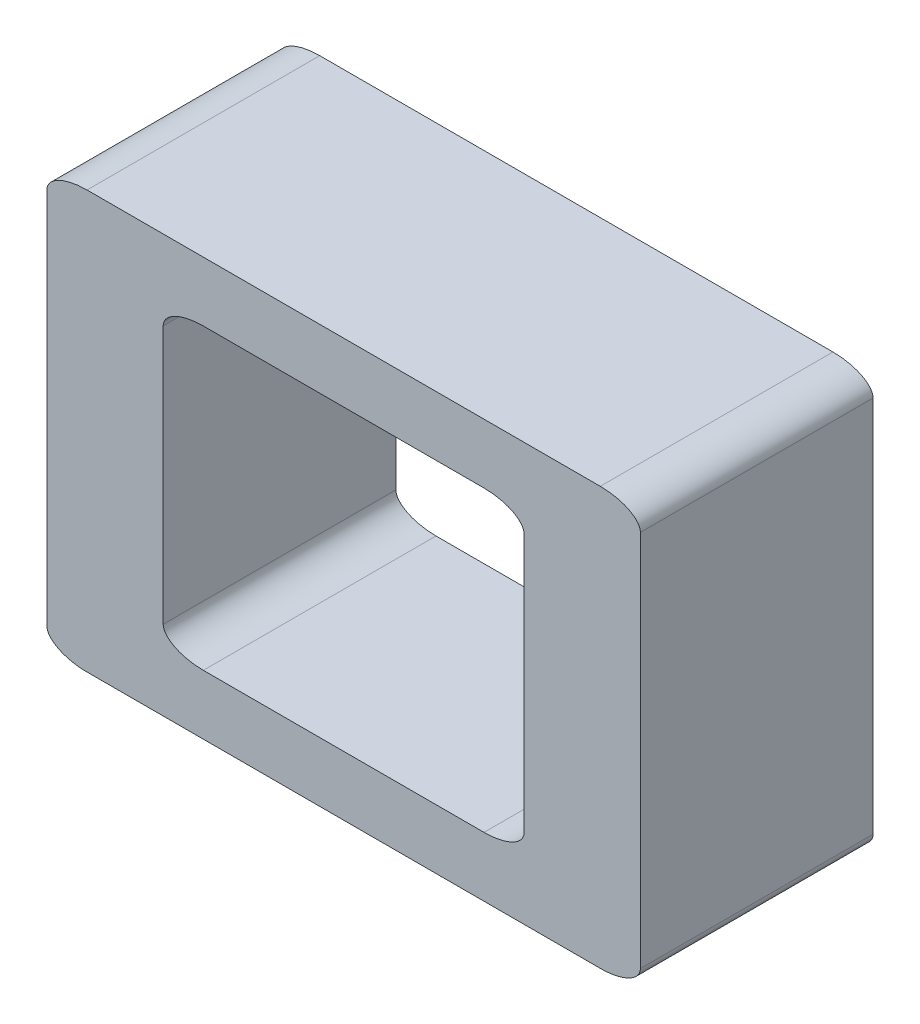
ISO-10303-21;
HEADER;
FILE_DESCRIPTION(('STEP AP214'),'2;1');
FILE_NAME('part.step','',(''),(''),'','','');
FILE_SCHEMA(('AUTOMOTIVE_DESIGN { 1 0 10303 214 1 1 1 1 }'));
ENDSEC;
DATA;
#1=APPLICATION_CONTEXT('core data for automotive mechanical design processes');
#2=APPLICATION_PROTOCOL_DEFINITION('international standard','automotive_design',2000,#1);
#3=PRODUCT_CONTEXT('',#1,'mechanical');
#4=PRODUCT('Part','Part','',(#3));
#5=PRODUCT_RELATED_PRODUCT_CATEGORY('part','',(#4));
#6=PRODUCT_DEFINITION_FORMATION('','',#4);
#7=PRODUCT_DEFINITION_CONTEXT('part definition',#1,'design');
#8=PRODUCT_DEFINITION('design','',#6,#7);
#9=PRODUCT_DEFINITION_SHAPE('','',#8);
#10=(LENGTH_UNIT() NAMED_UNIT(*) SI_UNIT(.MILLI.,.METRE.));
#11=(NAMED_UNIT(*) PLANE_ANGLE_UNIT() SI_UNIT($,.RADIAN.));
#12=(NAMED_UNIT(*) SI_UNIT($,.STERADIAN.) SOLID_ANGLE_UNIT());
#13=UNCERTAINTY_MEASURE_WITH_UNIT(LENGTH_MEASURE(1.E-05),#10,'distance_accuracy_value','');
#14=(GEOMETRIC_REPRESENTATION_CONTEXT(3) GLOBAL_UNCERTAINTY_ASSIGNED_CONTEXT((#13)) GLOBAL_UNIT_ASSIGNED_CONTEXT((#10,
#11,#12)) REPRESENTATION_CONTEXT('',''));
#15=CARTESIAN_POINT('',(0.,0.,0.));
#16=DIRECTION('',(0.,0.,1.));
#17=DIRECTION('',(1.,0.,0.));
#18=AXIS2_PLACEMENT_3D('',#15,#16,#17);
#19=CARTESIAN_POINT('',(6.25,6.5,2.3));
#20=DIRECTION('',(0.,0.,-1.));
#21=DIRECTION('',(-1.,0.,0.));
#22=AXIS2_PLACEMENT_3D('',#19,#20,#21);
#23=PLANE('',#22);
#24=DIRECTION('',(1.,0.,0.));
#25=VECTOR('',#24,1.);
#26=CARTESIAN_POINT('',(-3.569230755,13.407894736842,2.3));
#27=LINE('',#26,#25);
#28=CARTESIAN_POINT('',(-2.24230768,13.407894736842,2.3));
#29=VERTEX_POINT('',#28);
#30=CARTESIAN_POINT('',(14.74230768,13.407894736842,2.3));
#31=VERTEX_POINT('',#30);
#32=EDGE_CURVE('E11',#29,#31,#27,.T.);
#33=ORIENTED_EDGE('',*,*,#32,.T.);
#34=CARTESIAN_POINT('',(14.74230768,13.407894736842,2.3));
#35=CARTESIAN_POINT('',(15.519601221109,13.407894736842,2.3));
#36=CARTESIAN_POINT('',(16.069230755,13.135385814228,2.3));
#37=CARTESIAN_POINT('',(16.069230755,12.75,2.3));
#38=(BOUNDED_CURVE() B_SPLINE_CURVE(3,(#34,#35,#36,#37),.UNSPECIFIED.,.F.,
.F.) B_SPLINE_CURVE_WITH_KNOTS((4,4),(0.,1.),
.UNSPECIFIED.) CURVE() GEOMETRIC_REPRESENTATION_ITEM() RATIONAL_B_SPLINE_CURVE((1.,
0.804737854124,0.804737854124,1.)) REPRESENTATION_ITEM(''));
#39=CARTESIAN_POINT('',(16.069230755,12.75,2.3));
#40=VERTEX_POINT('',#39);
#41=EDGE_CURVE('E24',#31,#40,#38,.T.);
#42=ORIENTED_EDGE('',*,*,#41,.T.);
#43=DIRECTION('',(0.,-1.,0.));
#44=VECTOR('',#43,1.);
#45=CARTESIAN_POINT('',(16.069230755,13.407894736842,2.3));
#46=LINE('',#45,#44);
#47=CARTESIAN_POINT('',(16.069230755,0.25,2.3));
#48=VERTEX_POINT('',#47);
#49=EDGE_CURVE('E325',#40,#48,#46,.T.);
#50=ORIENTED_EDGE('',*,*,#49,.T.);
#51=CARTESIAN_POINT('',(16.069230755,0.25,2.3));
#52=CARTESIAN_POINT('',(16.069230755,-0.135385814228,2.3));
#53=CARTESIAN_POINT('',(15.519601221109,-0.407894736842,2.3));
#54=CARTESIAN_POINT('',(14.74230768,-0.407894736842,2.3));
#55=(BOUNDED_CURVE() B_SPLINE_CURVE(3,(#51,#52,#53,#54),.UNSPECIFIED.,.F.,
.F.) B_SPLINE_CURVE_WITH_KNOTS((4,4),(0.,1.),
.UNSPECIFIED.) CURVE() GEOMETRIC_REPRESENTATION_ITEM() RATIONAL_B_SPLINE_CURVE((1.,
0.804737854124,0.804737854124,1.)) REPRESENTATION_ITEM(''));
#56=CARTESIAN_POINT('',(14.74230768,-0.407894736842,2.3));
#57=VERTEX_POINT('',#56);
#58=EDGE_CURVE('E321',#48,#57,#55,.T.);
#59=ORIENTED_EDGE('',*,*,#58,.T.);
#60=DIRECTION('',(-1.,0.,0.));
#61=VECTOR('',#60,1.);
#62=CARTESIAN_POINT('',(16.069230755,-0.407894736842,2.3));
#63=LINE('',#62,#61);
#64=CARTESIAN_POINT('',(-2.24230768,-0.407894736842,2.3));
#65=VERTEX_POINT('',#64);
#66=EDGE_CURVE('E316',#57,#65,#63,.T.);
#67=ORIENTED_EDGE('',*,*,#66,.T.);
#68=CARTESIAN_POINT('',(-3.569230755,0.25,2.3));
#69=CARTESIAN_POINT('',(-3.569230755,-0.135385814228,2.3));
#70=CARTESIAN_POINT('',(-3.019601221109,-0.407894736842,2.3));
#71=CARTESIAN_POINT('',(-2.24230768,-0.407894736842,2.3));
#72=(BOUNDED_CURVE() B_SPLINE_CURVE(3,(#68,#69,#70,#71),.UNSPECIFIED.,.F.,
.F.) B_SPLINE_CURVE_WITH_KNOTS((4,4),(0.,1.),
.UNSPECIFIED.) CURVE() GEOMETRIC_REPRESENTATION_ITEM() RATIONAL_B_SPLINE_CURVE((1.,
0.804737854124,0.804737854124,1.)) REPRESENTATION_ITEM(''));
#73=CARTESIAN_POINT('',(-3.569230755,0.25,2.3));
#74=VERTEX_POINT('',#73);
#75=EDGE_CURVE('E311',#74,#65,#72,.T.);
#76=ORIENTED_EDGE('',*,*,#75,.F.);
#77=DIRECTION('',(0.,1.,0.));
#78=VECTOR('',#77,1.);
#79=CARTESIAN_POINT('',(-3.569230755,-0.407894736842,2.3));
#80=LINE('',#79,#78);
#81=CARTESIAN_POINT('',(-3.569230755,12.75,2.3));
#82=VERTEX_POINT('',#81);
#83=EDGE_CURVE('E306',#74,#82,#80,.T.);
#84=ORIENTED_EDGE('',*,*,#83,.T.);
#85=CARTESIAN_POINT('',(-2.24230768,13.407894736842,2.3));
#86=CARTESIAN_POINT('',(-3.019601221109,13.407894736842,2.3));
#87=CARTESIAN_POINT('',(-3.569230755,13.135385814228,2.3));
#88=CARTESIAN_POINT('',(-3.569230755,12.75,2.3));
#89=(BOUNDED_CURVE() B_SPLINE_CURVE(3,(#85,#86,#87,#88),.UNSPECIFIED.,.F.,
.F.) B_SPLINE_CURVE_WITH_KNOTS((4,4),(0.,1.),
.UNSPECIFIED.) CURVE() GEOMETRIC_REPRESENTATION_ITEM() RATIONAL_B_SPLINE_CURVE((1.,
0.804737854124,0.804737854124,1.)) REPRESENTATION_ITEM(''));
#90=EDGE_CURVE('E301',#29,#82,#89,.T.);
#91=ORIENTED_EDGE('',*,*,#90,.F.);
#92=EDGE_LOOP('',(#33,#42,#50,#59,#67,#76,#84,#91));
#93=FACE_BOUND('',#92,.T.);
#94=DIRECTION('',(1.,0.,0.));
#95=VECTOR('',#94,1.);
#96=CARTESIAN_POINT('',(0.2788461625,11.434210526316,2.3));
#97=LINE('',#96,#95);
#98=CARTESIAN_POINT('',(1.6057692375,11.434210526316,2.3));
#99=VERTEX_POINT('',#98);
#100=CARTESIAN_POINT('',(10.8942307625,11.434210526316,2.3));
#101=VERTEX_POINT('',#100);
#102=EDGE_CURVE('E296',#99,#101,#97,.T.);
#103=ORIENTED_EDGE('',*,*,#102,.F.);
#104=CARTESIAN_POINT('',(1.6057692375,11.434210526316,2.3));
#105=CARTESIAN_POINT('',(0.828475696391,11.434210526316,2.3));
#106=CARTESIAN_POINT('',(0.2788461625,11.161701603702,2.3));
#107=CARTESIAN_POINT('',(0.2788461625,10.776315789474,2.3));
#108=(BOUNDED_CURVE() B_SPLINE_CURVE(3,(#104,#105,#106,#107),.UNSPECIFIED.,.F.,
.F.) B_SPLINE_CURVE_WITH_KNOTS((4,4),(0.,1.),
.UNSPECIFIED.) CURVE() GEOMETRIC_REPRESENTATION_ITEM() RATIONAL_B_SPLINE_CURVE((1.,
0.804737854124,0.804737854124,1.)) REPRESENTATION_ITEM(''));
#109=CARTESIAN_POINT('',(0.2788461625,10.776315789474,2.3));
#110=VERTEX_POINT('',#109);
#111=EDGE_CURVE('E292',#99,#110,#108,.T.);
#112=ORIENTED_EDGE('',*,*,#111,.T.);
#113=DIRECTION('',(0.,1.,0.));
#114=VECTOR('',#113,1.);
#115=CARTESIAN_POINT('',(0.2788461625,1.565789473684,2.3));
#116=LINE('',#115,#114);
#117=CARTESIAN_POINT('',(0.2788461625,2.223684210526,2.3));
#118=VERTEX_POINT('',#117);
#119=EDGE_CURVE('E286',#118,#110,#116,.T.);
#120=ORIENTED_EDGE('',*,*,#119,.F.);
#121=CARTESIAN_POINT('',(1.6057692375,1.565789473684,2.3));
#122=CARTESIAN_POINT('',(0.828475696391,1.565789473684,2.3));
#123=CARTESIAN_POINT('',(0.2788461625,1.838298396298,2.3));
#124=CARTESIAN_POINT('',(0.2788461625,2.223684210526,2.3));
#125=(BOUNDED_CURVE() B_SPLINE_CURVE(3,(#121,#122,#123,#124),.UNSPECIFIED.,.F.,
.F.) B_SPLINE_CURVE_WITH_KNOTS((4,4),(0.,1.),
.UNSPECIFIED.) CURVE() GEOMETRIC_REPRESENTATION_ITEM() RATIONAL_B_SPLINE_CURVE((1.,
0.804737854124,0.804737854124,1.)) REPRESENTATION_ITEM(''));
#126=CARTESIAN_POINT('',(1.6057692375,1.565789473684,2.3));
#127=VERTEX_POINT('',#126);
#128=EDGE_CURVE('E281',#127,#118,#125,.T.);
#129=ORIENTED_EDGE('',*,*,#128,.F.);
#130=DIRECTION('',(-1.,0.,0.));
#131=VECTOR('',#130,1.);
#132=CARTESIAN_POINT('',(12.2211538375,1.565789473684,2.3));
#133=LINE('',#132,#131);
#134=CARTESIAN_POINT('',(10.8942307625,1.565789473684,2.3));
#135=VERTEX_POINT('',#134);
#136=EDGE_CURVE('E276',#135,#127,#133,.T.);
#137=ORIENTED_EDGE('',*,*,#136,.F.);
#138=CARTESIAN_POINT('',(12.2211538375,2.223684210526,2.3));
#139=CARTESIAN_POINT('',(12.2211538375,1.838298396298,2.3));
#140=CARTESIAN_POINT('',(11.671524303609,1.565789473684,2.3));
#141=CARTESIAN_POINT('',(10.8942307625,1.565789473684,2.3));
#142=(BOUNDED_CURVE() B_SPLINE_CURVE(3,(#138,#139,#140,#141),.UNSPECIFIED.,.F.,
.F.) B_SPLINE_CURVE_WITH_KNOTS((4,4),(0.,1.),
.UNSPECIFIED.) CURVE() GEOMETRIC_REPRESENTATION_ITEM() RATIONAL_B_SPLINE_CURVE((1.,
0.804737854124,0.804737854124,1.)) REPRESENTATION_ITEM(''));
#143=CARTESIAN_POINT('',(12.2211538375,2.223684210526,2.3));
#144=VERTEX_POINT('',#143);
#145=EDGE_CURVE('E141',#144,#135,#142,.T.);
#146=ORIENTED_EDGE('',*,*,#145,.F.);
#147=DIRECTION('',(0.,-1.,0.));
#148=VECTOR('',#147,1.);
#149=CARTESIAN_POINT('',(12.2211538375,11.434210526316,2.3));
#150=LINE('',#149,#148);
#151=CARTESIAN_POINT('',(12.2211538375,10.776315789474,2.3));
#152=VERTEX_POINT('',#151);
#153=EDGE_CURVE('E267',#152,#144,#150,.T.);
#154=ORIENTED_EDGE('',*,*,#153,.F.);
#155=CARTESIAN_POINT('',(10.8942307625,11.434210526316,2.3));
#156=CARTESIAN_POINT('',(11.671524303609,11.434210526316,2.3));
#157=CARTESIAN_POINT('',(12.2211538375,11.161701603702,2.3));
#158=CARTESIAN_POINT('',(12.2211538375,10.776315789474,2.3));
#159=(BOUNDED_CURVE() B_SPLINE_CURVE(3,(#155,#156,#157,#158),.UNSPECIFIED.,.F.,
.F.) B_SPLINE_CURVE_WITH_KNOTS((4,4),(0.,1.),
.UNSPECIFIED.) CURVE() GEOMETRIC_REPRESENTATION_ITEM() RATIONAL_B_SPLINE_CURVE((1.,
0.804737854124,0.804737854124,1.)) REPRESENTATION_ITEM(''));
#160=EDGE_CURVE('E262',#101,#152,#159,.T.);
#161=ORIENTED_EDGE('',*,*,#160,.F.);
#162=EDGE_LOOP('',(#103,#112,#120,#129,#137,#146,#154,#161));
#163=FACE_BOUND('',#162,.T.);
#164=ADVANCED_FACE('F17',(#93,#163),#23,.T.);
#165=CARTESIAN_POINT('',(-3.569230755,13.407894736842,2.3));
#166=DIRECTION('',(0.,1.,0.));
#167=DIRECTION('',(1.,0.,0.));
#168=AXIS2_PLACEMENT_3D('',#165,#166,#167);
#169=PLANE('',#168);
#170=ORIENTED_EDGE('',*,*,#32,.F.);
#171=DIRECTION('',(0.,0.,1.));
#172=VECTOR('',#171,1.);
#173=CARTESIAN_POINT('',(-2.24230768,13.407894736842,2.3));
#174=LINE('',#173,#172);
#175=CARTESIAN_POINT('',(-2.24230768,13.407894736842,10.));
#176=VERTEX_POINT('',#175);
#177=EDGE_CURVE('E260',#29,#176,#174,.T.);
#178=ORIENTED_EDGE('',*,*,#177,.T.);
#179=DIRECTION('',(1.,0.,0.));
#180=VECTOR('',#179,1.);
#181=CARTESIAN_POINT('',(-3.569230755,13.407894736842,10.));
#182=LINE('',#181,#180);
#183=CARTESIAN_POINT('',(14.74230768,13.407894736842,10.));
#184=VERTEX_POINT('',#183);
#185=EDGE_CURVE('E258',#176,#184,#182,.T.);
#186=ORIENTED_EDGE('',*,*,#185,.T.);
#187=DIRECTION('',(0.,0.,1.));
#188=VECTOR('',#187,1.);
#189=CARTESIAN_POINT('',(14.74230768,13.407894736842,2.3));
#190=LINE('',#189,#188);
#191=EDGE_CURVE('E255',#31,#184,#190,.T.);
#192=ORIENTED_EDGE('',*,*,#191,.F.);
#193=EDGE_LOOP('',(#170,#178,#186,#192));
#194=FACE_BOUND('',#193,.T.);
#195=ADVANCED_FACE('F369',(#194),#169,.T.);
#196=CARTESIAN_POINT('',(-2.242307680024,13.407894736842,2.3));
#197=CARTESIAN_POINT('',(-2.242307680024,13.407894736842,10.));
#198=CARTESIAN_POINT('',(-3.12692306337,13.407894736834,2.3));
#199=CARTESIAN_POINT('',(-3.12692306337,13.407894736834,10.));
#200=CARTESIAN_POINT('',(-3.56923075501,13.078947368409,2.3));
#201=CARTESIAN_POINT('',(-3.56923075501,13.078947368409,10.));
#202=CARTESIAN_POINT('',(-3.569230755,12.749999999994,2.3));
#203=CARTESIAN_POINT('',(-3.569230755,12.749999999994,10.));
#204=(BOUNDED_SURFACE() B_SPLINE_SURFACE(3,1,((#196,#197),(#198,#199),(#200,#201),(#202,#203)),
.UNSPECIFIED.,.F.,.F.,.F.) B_SPLINE_SURFACE_WITH_KNOTS((4,4),(2,2),(0.250000000002,0.5),(0.,1.),
.UNSPECIFIED.) GEOMETRIC_REPRESENTATION_ITEM() RATIONAL_B_SPLINE_SURFACE(((0.5,0.5),
(0.500000000003,0.500000000003),(0.666666666674,0.666666666674),(1.00000000001,1.00000000001))) REPRESENTATION_ITEM('') SURFACE());
#205=DIRECTION('',(0.,0.,1.));
#206=VECTOR('',#205,1.);
#207=CARTESIAN_POINT('',(-3.569230755,12.75,2.3));
#208=LINE('',#207,#206);
#209=CARTESIAN_POINT('',(-3.569230755,12.75,10.));
#210=VERTEX_POINT('',#209);
#211=EDGE_CURVE('E250',#82,#210,#208,.T.);
#212=CARTESIAN_POINT('',(-2.24230768,13.407894736842,10.));
#213=CARTESIAN_POINT('',(-3.019601221109,13.407894736842,10.));
#214=CARTESIAN_POINT('',(-3.569230755,13.135385814228,10.));
#215=CARTESIAN_POINT('',(-3.569230755,12.75,10.));
#216=(BOUNDED_CURVE() B_SPLINE_CURVE(3,(#212,#213,#214,#215),.UNSPECIFIED.,.F.,
.F.) B_SPLINE_CURVE_WITH_KNOTS((4,4),(0.,1.),
.UNSPECIFIED.) CURVE() GEOMETRIC_REPRESENTATION_ITEM() RATIONAL_B_SPLINE_CURVE((1.,
0.804737854124,0.804737854124,1.)) REPRESENTATION_ITEM(''));
#217=EDGE_CURVE('E242',#176,#210,#216,.T.);
#218=ORIENTED_EDGE('',*,*,#90,.T.);
#219=ORIENTED_EDGE('',*,*,#211,.T.);
#220=ORIENTED_EDGE('',*,*,#217,.F.);
#221=ORIENTED_EDGE('',*,*,#177,.F.);
#222=EDGE_LOOP('',(#218,#219,#220,#221));
#223=FACE_BOUND('',#222,.T.);
#224=ADVANCED_FACE('F368',(#223),#204,.T.);
#225=CARTESIAN_POINT('',(16.069230755,12.75,2.3));
#226=CARTESIAN_POINT('',(16.069230755,12.75,10.));
#227=CARTESIAN_POINT('',(16.069230755,13.078947368421,2.3));
#228=CARTESIAN_POINT('',(16.069230755,13.078947368421,10.));
#229=CARTESIAN_POINT('',(15.626923063333,13.407894736842,2.3));
#230=CARTESIAN_POINT('',(15.626923063333,13.407894736842,10.));
#231=CARTESIAN_POINT('',(14.74230768,13.407894736842,2.3));
#232=CARTESIAN_POINT('',(14.74230768,13.407894736842,10.));
#233=(BOUNDED_SURFACE() B_SPLINE_SURFACE(3,1,((#225,#226),(#227,#228),(#229,#230),(#231,#232)),
.UNSPECIFIED.,.F.,.F.,.F.) B_SPLINE_SURFACE_WITH_KNOTS((4,4),(2,2),(0.,0.25),(0.,1.),
.UNSPECIFIED.) GEOMETRIC_REPRESENTATION_ITEM() RATIONAL_B_SPLINE_SURFACE(((1.,1.),
(0.666666666667,0.666666666667),(0.5,0.5),(0.5,0.5))) REPRESENTATION_ITEM('') SURFACE());
#234=CARTESIAN_POINT('',(14.74230768,13.407894736842,10.));
#235=CARTESIAN_POINT('',(15.519601221109,13.407894736842,10.));
#236=CARTESIAN_POINT('',(16.069230755,13.135385814228,10.));
#237=CARTESIAN_POINT('',(16.069230755,12.75,10.));
#238=(BOUNDED_CURVE() B_SPLINE_CURVE(3,(#234,#235,#236,#237),.UNSPECIFIED.,.F.,
.F.) B_SPLINE_CURVE_WITH_KNOTS((4,4),(0.,1.),
.UNSPECIFIED.) CURVE() GEOMETRIC_REPRESENTATION_ITEM() RATIONAL_B_SPLINE_CURVE((1.,
0.804737854124,0.804737854124,1.)) REPRESENTATION_ITEM(''));
#239=CARTESIAN_POINT('',(16.069230755,12.75,10.));
#240=VERTEX_POINT('',#239);
#241=EDGE_CURVE('E238',#184,#240,#238,.T.);
#242=DIRECTION('',(0.,0.,1.));
#243=VECTOR('',#242,1.);
#244=CARTESIAN_POINT('',(16.069230755,12.75,2.3));
#245=LINE('',#244,#243);
#246=EDGE_CURVE('E235',#40,#240,#245,.T.);
#247=ORIENTED_EDGE('',*,*,#191,.T.);
#248=ORIENTED_EDGE('',*,*,#241,.T.);
#249=ORIENTED_EDGE('',*,*,#246,.F.);
#250=ORIENTED_EDGE('',*,*,#41,.F.);
#251=EDGE_LOOP('',(#247,#248,#249,#250));
#252=FACE_BOUND('',#251,.T.);
#253=ADVANCED_FACE('F343',(#252),#233,.T.);
#254=CARTESIAN_POINT('',(-3.569230755,-0.407894736842,2.3));
#255=DIRECTION('',(-1.,0.,0.));
#256=DIRECTION('',(0.,1.,0.));
#257=AXIS2_PLACEMENT_3D('',#254,#255,#256);
#258=PLANE('',#257);
#259=ORIENTED_EDGE('',*,*,#83,.F.);
#260=DIRECTION('',(0.,0.,1.));
#261=VECTOR('',#260,1.);
#262=CARTESIAN_POINT('',(-3.569230755,0.25,2.3));
#263=LINE('',#262,#261);
#264=CARTESIAN_POINT('',(-3.569230755,0.25,10.));
#265=VERTEX_POINT('',#264);
#266=EDGE_CURVE('E233',#74,#265,#263,.T.);
#267=ORIENTED_EDGE('',*,*,#266,.T.);
#268=DIRECTION('',(0.,1.,0.));
#269=VECTOR('',#268,1.);
#270=CARTESIAN_POINT('',(-3.569230755,-0.407894736842,10.));
#271=LINE('',#270,#269);
#272=EDGE_CURVE('E230',#265,#210,#271,.T.);
#273=ORIENTED_EDGE('',*,*,#272,.T.);
#274=ORIENTED_EDGE('',*,*,#211,.F.);
#275=EDGE_LOOP('',(#259,#267,#273,#274));
#276=FACE_BOUND('',#275,.T.);
#277=ADVANCED_FACE('F365',(#276),#258,.T.);
#278=CARTESIAN_POINT('',(16.069230755,13.407894736842,2.3));
#279=DIRECTION('',(1.,0.,0.));
#280=DIRECTION('',(0.,-1.,0.));
#281=AXIS2_PLACEMENT_3D('',#278,#279,#280);
#282=PLANE('',#281);
#283=ORIENTED_EDGE('',*,*,#49,.F.);
#284=ORIENTED_EDGE('',*,*,#246,.T.);
#285=DIRECTION('',(0.,-1.,0.));
#286=VECTOR('',#285,1.);
#287=CARTESIAN_POINT('',(16.069230755,13.407894736842,10.));
#288=LINE('',#287,#286);
#289=CARTESIAN_POINT('',(16.069230755,0.25,10.));
#290=VERTEX_POINT('',#289);
#291=EDGE_CURVE('E228',#240,#290,#288,.T.);
#292=ORIENTED_EDGE('',*,*,#291,.T.);
#293=DIRECTION('',(0.,0.,1.));
#294=VECTOR('',#293,1.);
#295=CARTESIAN_POINT('',(16.069230755,0.25,2.3));
#296=LINE('',#295,#294);
#297=EDGE_CURVE('E225',#48,#290,#296,.T.);
#298=ORIENTED_EDGE('',*,*,#297,.F.);
#299=EDGE_LOOP('',(#283,#284,#292,#298));
#300=FACE_BOUND('',#299,.T.);
#301=ADVANCED_FACE('F341',(#300),#282,.T.);
#302=CARTESIAN_POINT('',(-3.569230755,0.250000000006,2.3));
#303=CARTESIAN_POINT('',(-3.569230755,0.250000000006,10.));
#304=CARTESIAN_POINT('',(-3.56923075501,-0.07894736841387,2.3));
#305=CARTESIAN_POINT('',(-3.56923075501,-0.07894736841387,10.));
#306=CARTESIAN_POINT('',(-3.126923063359,-0.407894736842,2.3));
#307=CARTESIAN_POINT('',(-3.126923063359,-0.407894736842,10.));
#308=CARTESIAN_POINT('',(-2.242307680023,-0.407894736848,2.3));
#309=CARTESIAN_POINT('',(-2.242307680023,-0.407894736848,10.));
#310=(BOUNDED_SURFACE() B_SPLINE_SURFACE(3,1,((#302,#303),(#304,#305),(#306,#307),(#308,#309)),
.UNSPECIFIED.,.F.,.F.,.F.) B_SPLINE_SURFACE_WITH_KNOTS((4,4),(2,2),(0.5,0.75),(0.,1.),
.UNSPECIFIED.) GEOMETRIC_REPRESENTATION_ITEM() RATIONAL_B_SPLINE_SURFACE(((1.00000000001,
1.00000000001),(0.666666666672,0.666666666672),(0.5,0.5),(0.499999999998,0.499999999998))) REPRESENTATION_ITEM('') SURFACE());
#311=DIRECTION('',(0.,0.,1.));
#312=VECTOR('',#311,1.);
#313=CARTESIAN_POINT('',(-2.24230768,-0.407894736842,2.3));
#314=LINE('',#313,#312);
#315=CARTESIAN_POINT('',(-2.24230768,-0.407894736842,10.));
#316=VERTEX_POINT('',#315);
#317=EDGE_CURVE('E220',#65,#316,#314,.T.);
#318=CARTESIAN_POINT('',(-3.569230755,0.25,10.));
#319=CARTESIAN_POINT('',(-3.569230755,-0.135385814228,10.));
#320=CARTESIAN_POINT('',(-3.019601221109,-0.407894736842,10.));
#321=CARTESIAN_POINT('',(-2.24230768,-0.407894736842,10.));
#322=(BOUNDED_CURVE() B_SPLINE_CURVE(3,(#318,#319,#320,#321),.UNSPECIFIED.,.F.,
.F.) B_SPLINE_CURVE_WITH_KNOTS((4,4),(0.,1.),
.UNSPECIFIED.) CURVE() GEOMETRIC_REPRESENTATION_ITEM() RATIONAL_B_SPLINE_CURVE((1.,
0.804737854124,0.804737854124,1.)) REPRESENTATION_ITEM(''));
#323=EDGE_CURVE('E212',#265,#316,#322,.T.);
#324=ORIENTED_EDGE('',*,*,#75,.T.);
#325=ORIENTED_EDGE('',*,*,#317,.T.);
#326=ORIENTED_EDGE('',*,*,#323,.F.);
#327=ORIENTED_EDGE('',*,*,#266,.F.);
#328=EDGE_LOOP('',(#324,#325,#326,#327));
#329=FACE_BOUND('',#328,.T.);
#330=ADVANCED_FACE('F359',(#329),#310,.T.);
#331=CARTESIAN_POINT('',(14.74230768,-0.407894736842,2.3));
#332=CARTESIAN_POINT('',(14.74230768,-0.407894736842,10.));
#333=CARTESIAN_POINT('',(15.626923063333,-0.407894736842,2.3));
#334=CARTESIAN_POINT('',(15.626923063333,-0.407894736842,10.));
#335=CARTESIAN_POINT('',(16.069230755,-0.07894736842105,2.3));
#336=CARTESIAN_POINT('',(16.069230755,-0.07894736842105,10.));
#337=CARTESIAN_POINT('',(16.069230755,0.25,2.3));
#338=CARTESIAN_POINT('',(16.069230755,0.25,10.));
#339=(BOUNDED_SURFACE() B_SPLINE_SURFACE(3,1,((#331,#332),(#333,#334),(#335,#336),(#337,#338)),
.UNSPECIFIED.,.F.,.F.,.F.) B_SPLINE_SURFACE_WITH_KNOTS((4,4),(2,2),(0.75,1.),(0.,1.),
.UNSPECIFIED.) GEOMETRIC_REPRESENTATION_ITEM() RATIONAL_B_SPLINE_SURFACE(((0.5,0.5),(0.5,0.5),
(0.666666666667,0.666666666667),(1.,1.))) REPRESENTATION_ITEM('') SURFACE());
#340=CARTESIAN_POINT('',(16.069230755,0.25,10.));
#341=CARTESIAN_POINT('',(16.069230755,-0.135385814228,10.));
#342=CARTESIAN_POINT('',(15.519601221109,-0.407894736842,10.));
#343=CARTESIAN_POINT('',(14.74230768,-0.407894736842,10.));
#344=(BOUNDED_CURVE() B_SPLINE_CURVE(3,(#340,#341,#342,#343),.UNSPECIFIED.,.F.,
.F.) B_SPLINE_CURVE_WITH_KNOTS((4,4),(0.,1.),
.UNSPECIFIED.) CURVE() GEOMETRIC_REPRESENTATION_ITEM() RATIONAL_B_SPLINE_CURVE((1.,
0.804737854124,0.804737854124,1.)) REPRESENTATION_ITEM(''));
#345=CARTESIAN_POINT('',(14.74230768,-0.407894736842,10.));
#346=VERTEX_POINT('',#345);
#347=EDGE_CURVE('E208',#290,#346,#344,.T.);
#348=DIRECTION('',(0.,0.,1.));
#349=VECTOR('',#348,1.);
#350=CARTESIAN_POINT('',(14.74230768,-0.407894736842,2.3));
#351=LINE('',#350,#349);
#352=EDGE_CURVE('E205',#57,#346,#351,.T.);
#353=ORIENTED_EDGE('',*,*,#297,.T.);
#354=ORIENTED_EDGE('',*,*,#347,.T.);
#355=ORIENTED_EDGE('',*,*,#352,.F.);
#356=ORIENTED_EDGE('',*,*,#58,.F.);
#357=EDGE_LOOP('',(#353,#354,#355,#356));
#358=FACE_BOUND('',#357,.T.);
#359=ADVANCED_FACE('F351',(#358),#339,.T.);
#360=CARTESIAN_POINT('',(16.069230755,-0.407894736842,2.3));
#361=DIRECTION('',(0.,-1.,0.));
#362=DIRECTION('',(-1.,0.,0.));
#363=AXIS2_PLACEMENT_3D('',#360,#361,#362);
#364=PLANE('',#363);
#365=ORIENTED_EDGE('',*,*,#66,.F.);
#366=ORIENTED_EDGE('',*,*,#352,.T.);
#367=DIRECTION('',(-1.,0.,0.));
#368=VECTOR('',#367,1.);
#369=CARTESIAN_POINT('',(16.069230755,-0.407894736842,10.));
#370=LINE('',#369,#368);
#371=EDGE_CURVE('E202',#346,#316,#370,.T.);
#372=ORIENTED_EDGE('',*,*,#371,.T.);
#373=ORIENTED_EDGE('',*,*,#317,.F.);
#374=EDGE_LOOP('',(#365,#366,#372,#373));
#375=FACE_BOUND('',#374,.T.);
#376=ADVANCED_FACE('F356',(#375),#364,.T.);
#377=CARTESIAN_POINT('',(0.2788461625,11.434210526316,10.));
#378=DIRECTION('',(0.,-1.,0.));
#379=DIRECTION('',(1.,0.,0.));
#380=AXIS2_PLACEMENT_3D('',#377,#378,#379);
#381=PLANE('',#380);
#382=DIRECTION('',(1.,0.,0.));
#383=VECTOR('',#382,1.);
#384=CARTESIAN_POINT('',(0.2788461625,11.434210526316,10.));
#385=LINE('',#384,#383);
#386=CARTESIAN_POINT('',(1.6057692375,11.434210526316,10.));
#387=VERTEX_POINT('',#386);
#388=CARTESIAN_POINT('',(10.8942307625,11.434210526316,10.));
#389=VERTEX_POINT('',#388);
#390=EDGE_CURVE('E200',#387,#389,#385,.T.);
#391=ORIENTED_EDGE('',*,*,#390,.F.);
#392=DIRECTION('',(0.,0.,-1.));
#393=VECTOR('',#392,1.);
#394=CARTESIAN_POINT('',(1.6057692375,11.434210526316,10.));
#395=LINE('',#394,#393);
#396=EDGE_CURVE('E197',#387,#99,#395,.T.);
#397=ORIENTED_EDGE('',*,*,#396,.T.);
#398=ORIENTED_EDGE('',*,*,#102,.T.);
#399=DIRECTION('',(0.,0.,-1.));
#400=VECTOR('',#399,1.);
#401=CARTESIAN_POINT('',(10.8942307625,11.434210526316,10.));
#402=LINE('',#401,#400);
#403=EDGE_CURVE('E191',#389,#101,#402,.T.);
#404=ORIENTED_EDGE('',*,*,#403,.F.);
#405=EDGE_LOOP('',(#391,#397,#398,#404));
#406=FACE_BOUND('',#405,.T.);
#407=ADVANCED_FACE('F418',(#406),#381,.T.);
#408=CARTESIAN_POINT('',(0.2788461625,10.776315789474,10.));
#409=CARTESIAN_POINT('',(0.2788461625,10.776315789474,2.3));
#410=CARTESIAN_POINT('',(0.2788461625,11.10526315789,10.));
#411=CARTESIAN_POINT('',(0.2788461625,11.10526315789,2.3));
#412=CARTESIAN_POINT('',(0.721153854156,11.434210526308,10.));
#413=CARTESIAN_POINT('',(0.721153854156,11.434210526308,2.3));
#414=CARTESIAN_POINT('',(1.605769237476,11.434210526316,10.));
#415=CARTESIAN_POINT('',(1.605769237476,11.434210526316,2.3));
#416=(BOUNDED_SURFACE() B_SPLINE_SURFACE(3,1,((#408,#409),(#410,#411),(#412,#413),(#414,#415)),
.UNSPECIFIED.,.F.,.F.,.F.) B_SPLINE_SURFACE_WITH_KNOTS((4,4),(2,2),(0.,0.249999999998),(0.,1.),
.UNSPECIFIED.) GEOMETRIC_REPRESENTATION_ITEM() RATIONAL_B_SPLINE_SURFACE(((1.,1.),
(0.66666666667,0.66666666667),(0.500000000003,0.500000000003),(0.5,0.5))) REPRESENTATION_ITEM('') SURFACE());
#417=CARTESIAN_POINT('',(1.6057692375,11.434210526316,10.));
#418=CARTESIAN_POINT('',(0.828475696391,11.434210526316,10.));
#419=CARTESIAN_POINT('',(0.2788461625,11.161701603702,10.));
#420=CARTESIAN_POINT('',(0.2788461625,10.776315789474,10.));
#421=(BOUNDED_CURVE() B_SPLINE_CURVE(3,(#417,#418,#419,#420),.UNSPECIFIED.,.F.,
.F.) B_SPLINE_CURVE_WITH_KNOTS((4,4),(0.,1.),
.UNSPECIFIED.) CURVE() GEOMETRIC_REPRESENTATION_ITEM() RATIONAL_B_SPLINE_CURVE((1.,
0.804737854124,0.804737854124,1.)) REPRESENTATION_ITEM(''));
#422=CARTESIAN_POINT('',(0.2788461625,10.776315789474,10.));
#423=VERTEX_POINT('',#422);
#424=EDGE_CURVE('E186',#387,#423,#421,.T.);
#425=DIRECTION('',(0.,0.,-1.));
#426=VECTOR('',#425,1.);
#427=CARTESIAN_POINT('',(0.2788461625,10.776315789474,10.));
#428=LINE('',#427,#426);
#429=EDGE_CURVE('E183',#423,#110,#428,.T.);
#430=ORIENTED_EDGE('',*,*,#424,.T.);
#431=ORIENTED_EDGE('',*,*,#429,.T.);
#432=ORIENTED_EDGE('',*,*,#111,.F.);
#433=ORIENTED_EDGE('',*,*,#396,.F.);
#434=EDGE_LOOP('',(#430,#431,#432,#433));
#435=FACE_BOUND('',#434,.T.);
#436=ADVANCED_FACE('F421',(#435),#416,.F.);
#437=CARTESIAN_POINT('',(10.8942307625,11.434210526316,10.));
#438=CARTESIAN_POINT('',(10.8942307625,11.434210526316,2.3));
#439=CARTESIAN_POINT('',(11.778846145859,11.434210526316,10.));
#440=CARTESIAN_POINT('',(11.778846145859,11.434210526316,2.3));
#441=CARTESIAN_POINT('',(12.22115383751,11.105263157888,10.));
#442=CARTESIAN_POINT('',(12.22115383751,11.105263157888,2.3));
#443=CARTESIAN_POINT('',(12.2211538375,10.776315789467,10.));
#444=CARTESIAN_POINT('',(12.2211538375,10.776315789467,2.3));
#445=(BOUNDED_SURFACE() B_SPLINE_SURFACE(3,1,((#437,#438),(#439,#440),(#441,#442),(#443,#444)),
.UNSPECIFIED.,.F.,.F.,.F.) B_SPLINE_SURFACE_WITH_KNOTS((4,4),(2,2),(0.25,0.5),(0.,1.),
.UNSPECIFIED.) GEOMETRIC_REPRESENTATION_ITEM() RATIONAL_B_SPLINE_SURFACE(((0.5,0.5),(0.5,0.5),
(0.666666666672,0.666666666672),(1.00000000001,1.00000000001))) REPRESENTATION_ITEM('') SURFACE());
#446=DIRECTION('',(0.,0.,-1.));
#447=VECTOR('',#446,1.);
#448=CARTESIAN_POINT('',(12.2211538375,10.776315789474,10.));
#449=LINE('',#448,#447);
#450=CARTESIAN_POINT('',(12.2211538375,10.776315789474,10.));
#451=VERTEX_POINT('',#450);
#452=EDGE_CURVE('E177',#451,#152,#449,.T.);
#453=CARTESIAN_POINT('',(10.8942307625,11.434210526316,10.));
#454=CARTESIAN_POINT('',(11.671524303609,11.434210526316,10.));
#455=CARTESIAN_POINT('',(12.2211538375,11.161701603702,10.));
#456=CARTESIAN_POINT('',(12.2211538375,10.776315789474,10.));
#457=(BOUNDED_CURVE() B_SPLINE_CURVE(3,(#453,#454,#455,#456),.UNSPECIFIED.,.F.,
.F.) B_SPLINE_CURVE_WITH_KNOTS((4,4),(0.,1.),
.UNSPECIFIED.) CURVE() GEOMETRIC_REPRESENTATION_ITEM() RATIONAL_B_SPLINE_CURVE((1.,
0.804737854124,0.804737854124,1.)) REPRESENTATION_ITEM(''));
#458=EDGE_CURVE('E173',#389,#451,#457,.T.);
#459=ORIENTED_EDGE('',*,*,#403,.T.);
#460=ORIENTED_EDGE('',*,*,#160,.T.);
#461=ORIENTED_EDGE('',*,*,#452,.F.);
#462=ORIENTED_EDGE('',*,*,#458,.F.);
#463=EDGE_LOOP('',(#459,#460,#461,#462));
#464=FACE_BOUND('',#463,.T.);
#465=ADVANCED_FACE('F427',(#464),#445,.F.);
#466=CARTESIAN_POINT('',(0.2788461625,1.565789473684,10.));
#467=DIRECTION('',(1.,0.,0.));
#468=DIRECTION('',(0.,1.,0.));
#469=AXIS2_PLACEMENT_3D('',#466,#467,#468);
#470=PLANE('',#469);
#471=DIRECTION('',(0.,1.,0.));
#472=VECTOR('',#471,1.);
#473=CARTESIAN_POINT('',(0.2788461625,1.565789473684,10.));
#474=LINE('',#473,#472);
#475=CARTESIAN_POINT('',(0.2788461625,2.223684210526,10.));
#476=VERTEX_POINT('',#475);
#477=EDGE_CURVE('E170',#476,#423,#474,.T.);
#478=ORIENTED_EDGE('',*,*,#477,.F.);
#479=DIRECTION('',(0.,0.,-1.));
#480=VECTOR('',#479,1.);
#481=CARTESIAN_POINT('',(0.2788461625,2.223684210526,10.));
#482=LINE('',#481,#480);
#483=EDGE_CURVE('E167',#476,#118,#482,.T.);
#484=ORIENTED_EDGE('',*,*,#483,.T.);
#485=ORIENTED_EDGE('',*,*,#119,.T.);
#486=ORIENTED_EDGE('',*,*,#429,.F.);
#487=EDGE_LOOP('',(#478,#484,#485,#486));
#488=FACE_BOUND('',#487,.T.);
#489=ADVANCED_FACE('F438',(#488),#470,.T.);
#490=CARTESIAN_POINT('',(12.2211538375,11.434210526316,10.));
#491=DIRECTION('',(-1.,0.,0.));
#492=DIRECTION('',(0.,-1.,0.));
#493=AXIS2_PLACEMENT_3D('',#490,#491,#492);
#494=PLANE('',#493);
#495=DIRECTION('',(0.,-1.,0.));
#496=VECTOR('',#495,1.);
#497=CARTESIAN_POINT('',(12.2211538375,11.434210526316,10.));
#498=LINE('',#497,#496);
#499=CARTESIAN_POINT('',(12.2211538375,2.223684210526,10.));
#500=VERTEX_POINT('',#499);
#501=EDGE_CURVE('E132',#451,#500,#498,.T.);
#502=ORIENTED_EDGE('',*,*,#501,.F.);
#503=ORIENTED_EDGE('',*,*,#452,.T.);
#504=ORIENTED_EDGE('',*,*,#153,.T.);
#505=DIRECTION('',(0.,0.,-1.));
#506=VECTOR('',#505,1.);
#507=CARTESIAN_POINT('',(12.2211538375,2.223684210526,10.));
#508=LINE('',#507,#506);
#509=EDGE_CURVE('E164',#500,#144,#508,.T.);
#510=ORIENTED_EDGE('',*,*,#509,.F.);
#511=EDGE_LOOP('',(#502,#503,#504,#510));
#512=FACE_BOUND('',#511,.T.);
#513=ADVANCED_FACE('F447',(#512),#494,.T.);
#514=CARTESIAN_POINT('',(1.6057692375,1.565789473684,10.));
#515=CARTESIAN_POINT('',(1.6057692375,1.565789473684,2.3));
#516=CARTESIAN_POINT('',(0.721153854167,1.565789473684,10.));
#517=CARTESIAN_POINT('',(0.721153854167,1.565789473684,2.3));
#518=CARTESIAN_POINT('',(0.2788461625,1.894736842105,10.));
#519=CARTESIAN_POINT('',(0.2788461625,1.894736842105,2.3));
#520=CARTESIAN_POINT('',(0.2788461625,2.223684210526,10.));
#521=CARTESIAN_POINT('',(0.2788461625,2.223684210526,2.3));
#522=(BOUNDED_SURFACE() B_SPLINE_SURFACE(3,1,((#514,#515),(#516,#517),(#518,#519),(#520,#521)),
.UNSPECIFIED.,.F.,.F.,.F.) B_SPLINE_SURFACE_WITH_KNOTS((4,4),(2,2),(0.75,1.),(0.,1.),
.UNSPECIFIED.) GEOMETRIC_REPRESENTATION_ITEM() RATIONAL_B_SPLINE_SURFACE(((0.5,0.5),(0.5,0.5),
(0.666666666667,0.666666666667),(1.,1.))) REPRESENTATION_ITEM('') SURFACE());
#523=DIRECTION('',(0.,0.,-1.));
#524=VECTOR('',#523,1.);
#525=CARTESIAN_POINT('',(1.6057692375,1.565789473684,10.));
#526=LINE('',#525,#524);
#527=CARTESIAN_POINT('',(1.6057692375,1.565789473684,10.));
#528=VERTEX_POINT('',#527);
#529=EDGE_CURVE('E149',#528,#127,#526,.T.);
#530=CARTESIAN_POINT('',(1.6057692375,1.565789473684,10.));
#531=CARTESIAN_POINT('',(0.828475696391,1.565789473684,10.));
#532=CARTESIAN_POINT('',(0.2788461625,1.838298396298,10.));
#533=CARTESIAN_POINT('',(0.2788461625,2.223684210526,10.));
#534=(BOUNDED_CURVE() B_SPLINE_CURVE(3,(#530,#531,#532,#533),.UNSPECIFIED.,.F.,
.F.) B_SPLINE_CURVE_WITH_KNOTS((4,4),(0.,1.),
.UNSPECIFIED.) CURVE() GEOMETRIC_REPRESENTATION_ITEM() RATIONAL_B_SPLINE_CURVE((1.,
0.804737854124,0.804737854124,1.)) REPRESENTATION_ITEM(''));
#535=EDGE_CURVE('E144',#528,#476,#534,.T.);
#536=ORIENTED_EDGE('',*,*,#529,.T.);
#537=ORIENTED_EDGE('',*,*,#128,.T.);
#538=ORIENTED_EDGE('',*,*,#483,.F.);
#539=ORIENTED_EDGE('',*,*,#535,.F.);
#540=EDGE_LOOP('',(#536,#537,#538,#539));
#541=FACE_BOUND('',#540,.T.);
#542=ADVANCED_FACE('F451',(#541),#522,.F.);
#543=CARTESIAN_POINT('',(12.2211538375,2.22368421052,10.));
#544=CARTESIAN_POINT('',(12.2211538375,2.22368421052,2.3));
#545=CARTESIAN_POINT('',(12.22115383749,1.894736842098,10.));
#546=CARTESIAN_POINT('',(12.22115383749,1.894736842098,2.3));
#547=CARTESIAN_POINT('',(11.778846145808,1.565789473684,10.));
#548=CARTESIAN_POINT('',(11.778846145808,1.565789473684,2.3));
#549=CARTESIAN_POINT('',(10.894230762477,1.565789473691,10.));
#550=CARTESIAN_POINT('',(10.894230762477,1.565789473691,2.3));
#551=(BOUNDED_SURFACE() B_SPLINE_SURFACE(3,1,((#543,#544),(#545,#546),(#547,#548),(#549,#550)),
.UNSPECIFIED.,.F.,.F.,.F.) B_SPLINE_SURFACE_WITH_KNOTS((4,4),(2,2),(0.5,0.75),(0.,1.),
.UNSPECIFIED.) GEOMETRIC_REPRESENTATION_ITEM() RATIONAL_B_SPLINE_SURFACE(((0.99999999999,
0.99999999999),(0.666666666662,0.666666666662),(0.5,0.5),(0.500000000002,0.500000000002))) REPRESENTATION_ITEM('') SURFACE());
#552=DIRECTION('',(0.,0.,-1.));
#553=VECTOR('',#552,1.);
#554=CARTESIAN_POINT('',(10.8942307625,1.565789473684,10.));
#555=LINE('',#554,#553);
#556=CARTESIAN_POINT('',(10.8942307625,1.565789473684,10.));
#557=VERTEX_POINT('',#556);
#558=EDGE_CURVE('E136',#557,#135,#555,.T.);
#559=CARTESIAN_POINT('',(12.2211538375,2.223684210526,10.));
#560=CARTESIAN_POINT('',(12.2211538375,1.838298396298,10.));
#561=CARTESIAN_POINT('',(11.671524303609,1.565789473684,10.));
#562=CARTESIAN_POINT('',(10.8942307625,1.565789473684,10.));
#563=(BOUNDED_CURVE() B_SPLINE_CURVE(3,(#559,#560,#561,#562),.UNSPECIFIED.,.F.,
.F.) B_SPLINE_CURVE_WITH_KNOTS((4,4),(0.,1.),
.UNSPECIFIED.) CURVE() GEOMETRIC_REPRESENTATION_ITEM() RATIONAL_B_SPLINE_CURVE((1.,
0.804737854124,0.804737854124,1.)) REPRESENTATION_ITEM(''));
#564=EDGE_CURVE('E125',#500,#557,#563,.T.);
#565=ORIENTED_EDGE('',*,*,#509,.T.);
#566=ORIENTED_EDGE('',*,*,#145,.T.);
#567=ORIENTED_EDGE('',*,*,#558,.F.);
#568=ORIENTED_EDGE('',*,*,#564,.F.);
#569=EDGE_LOOP('',(#565,#566,#567,#568));
#570=FACE_BOUND('',#569,.T.);
#571=ADVANCED_FACE('F140',(#570),#551,.F.);
#572=CARTESIAN_POINT('',(12.2211538375,1.565789473684,10.));
#573=DIRECTION('',(0.,1.,0.));
#574=DIRECTION('',(-1.,0.,0.));
#575=AXIS2_PLACEMENT_3D('',#572,#573,#574);
#576=PLANE('',#575);
#577=DIRECTION('',(-1.,0.,0.));
#578=VECTOR('',#577,1.);
#579=CARTESIAN_POINT('',(12.2211538375,1.565789473684,10.));
#580=LINE('',#579,#578);
#581=EDGE_CURVE('E130',#557,#528,#580,.T.);
#582=ORIENTED_EDGE('',*,*,#581,.F.);
#583=ORIENTED_EDGE('',*,*,#558,.T.);
#584=ORIENTED_EDGE('',*,*,#136,.T.);
#585=ORIENTED_EDGE('',*,*,#529,.F.);
#586=EDGE_LOOP('',(#582,#583,#584,#585));
#587=FACE_BOUND('',#586,.T.);
#588=ADVANCED_FACE('F147',(#587),#576,.T.);
#589=CARTESIAN_POINT('',(6.25,6.5,10.));
#590=DIRECTION('',(0.,0.,-1.));
#591=DIRECTION('',(-1.,0.,0.));
#592=AXIS2_PLACEMENT_3D('',#589,#590,#591);
#593=PLANE('',#592);
#594=ORIENTED_EDGE('',*,*,#217,.T.);
#595=ORIENTED_EDGE('',*,*,#272,.F.);
#596=ORIENTED_EDGE('',*,*,#323,.T.);
#597=ORIENTED_EDGE('',*,*,#371,.F.);
#598=ORIENTED_EDGE('',*,*,#347,.F.);
#599=ORIENTED_EDGE('',*,*,#291,.F.);
#600=ORIENTED_EDGE('',*,*,#241,.F.);
#601=ORIENTED_EDGE('',*,*,#185,.F.);
#602=EDGE_LOOP('',(#594,#595,#596,#597,#598,#599,#600,#601));
#603=FACE_BOUND('',#602,.T.);
#604=ORIENTED_EDGE('',*,*,#458,.T.);
#605=ORIENTED_EDGE('',*,*,#501,.T.);
#606=ORIENTED_EDGE('',*,*,#564,.T.);
#607=ORIENTED_EDGE('',*,*,#581,.T.);
#608=ORIENTED_EDGE('',*,*,#535,.T.);
#609=ORIENTED_EDGE('',*,*,#477,.T.);
#610=ORIENTED_EDGE('',*,*,#424,.F.);
#611=ORIENTED_EDGE('',*,*,#390,.T.);
#612=EDGE_LOOP('',(#604,#605,#606,#607,#608,#609,#610,#611));
#613=FACE_BOUND('',#612,.T.);
#614=ADVANCED_FACE('F127',(#603,#613),#593,.F.);
#615=CLOSED_SHELL('',(#164,#195,#224,#253,#277,#301,#330,#359,#376,#407,#436,#465,#489,#513,
#542,#571,#588,#614));
#616=MANIFOLD_SOLID_BREP('B1',#615);
#617=ADVANCED_BREP_SHAPE_REPRESENTATION('',(#18,#616),#14);
#618=SHAPE_DEFINITION_REPRESENTATION(#9,#617);
ENDSEC;
END-ISO-10303-21;
